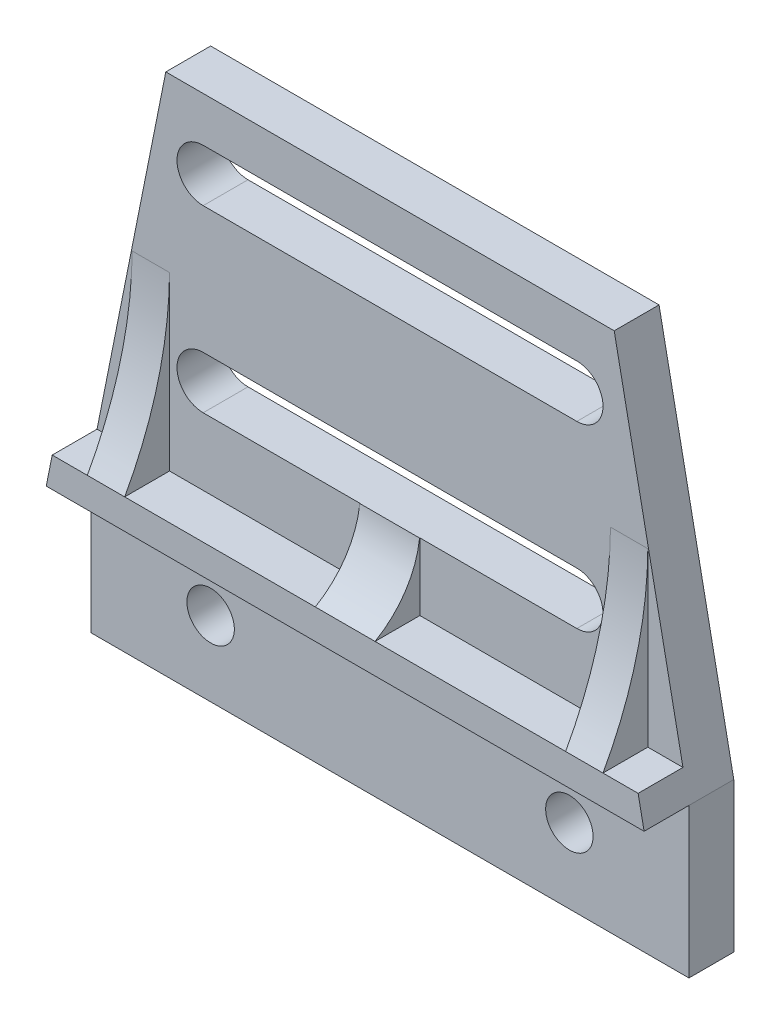
ISO-10303-21;
HEADER;
FILE_DESCRIPTION(('STEP AP214'),'2;1');
FILE_NAME('part.step','',(''),(''),'','','');
FILE_SCHEMA(('AUTOMOTIVE_DESIGN { 1 0 10303 214 1 1 1 1 }'));
ENDSEC;
DATA;
#1=APPLICATION_CONTEXT('core data for automotive mechanical design processes');
#2=APPLICATION_PROTOCOL_DEFINITION('international standard','automotive_design',2000,#1);
#3=PRODUCT_CONTEXT('',#1,'mechanical');
#4=PRODUCT('Part','Part','',(#3));
#5=PRODUCT_RELATED_PRODUCT_CATEGORY('part','',(#4));
#6=PRODUCT_DEFINITION_FORMATION('','',#4);
#7=PRODUCT_DEFINITION_CONTEXT('part definition',#1,'design');
#8=PRODUCT_DEFINITION('design','',#6,#7);
#9=PRODUCT_DEFINITION_SHAPE('','',#8);
#10=(LENGTH_UNIT() NAMED_UNIT(*) SI_UNIT(.MILLI.,.METRE.));
#11=(NAMED_UNIT(*) PLANE_ANGLE_UNIT() SI_UNIT($,.RADIAN.));
#12=(NAMED_UNIT(*) SI_UNIT($,.STERADIAN.) SOLID_ANGLE_UNIT());
#13=UNCERTAINTY_MEASURE_WITH_UNIT(LENGTH_MEASURE(1.E-05),#10,'distance_accuracy_value','');
#14=(GEOMETRIC_REPRESENTATION_CONTEXT(3) GLOBAL_UNCERTAINTY_ASSIGNED_CONTEXT((#13)) GLOBAL_UNIT_ASSIGNED_CONTEXT((#10,
#11,#12)) REPRESENTATION_CONTEXT('',''));
#15=CARTESIAN_POINT('',(0.,0.,0.));
#16=DIRECTION('',(0.,0.,1.));
#17=DIRECTION('',(1.,0.,0.));
#18=AXIS2_PLACEMENT_3D('',#15,#16,#17);
#19=CARTESIAN_POINT('',(0.,0.,3.));
#20=DIRECTION('',(0.,0.,1.));
#21=DIRECTION('',(1.,0.,0.));
#22=AXIS2_PLACEMENT_3D('',#19,#20,#21);
#23=PLANE('',#22);
#24=DIRECTION('',(0.,1.,0.));
#25=VECTOR('',#24,1.);
#26=CARTESIAN_POINT('',(-2.,0.,3.));
#27=LINE('',#26,#25);
#28=CARTESIAN_POINT('',(-2.,7.,3.));
#29=VERTEX_POINT('',#28);
#30=CARTESIAN_POINT('',(-2.,11.5,3.));
#31=VERTEX_POINT('',#30);
#32=EDGE_CURVE('E239',#29,#31,#27,.T.);
#33=ORIENTED_EDGE('',*,*,#32,.T.);
#34=DIRECTION('',(-1.,0.,0.));
#35=VECTOR('',#34,1.);
#36=CARTESIAN_POINT('',(0.,11.5,3.));
#37=LINE('',#36,#35);
#38=CARTESIAN_POINT('',(-12.5,11.5,3.));
#39=VERTEX_POINT('',#38);
#40=EDGE_CURVE('E228',#31,#39,#37,.T.);
#41=ORIENTED_EDGE('',*,*,#40,.T.);
#42=CARTESIAN_POINT('',(-12.5,13.25,3.));
#43=DIRECTION('',(0.,0.,1.));
#44=DIRECTION('',(1.,0.,0.));
#45=AXIS2_PLACEMENT_3D('',#42,#43,#44);
#46=CIRCLE('',#45,1.74999999999999);
#47=CARTESIAN_POINT('',(-12.5,15.,3.));
#48=VERTEX_POINT('',#47);
#49=EDGE_CURVE('E213',#39,#48,#46,.F.);
#50=ORIENTED_EDGE('',*,*,#49,.T.);
#51=DIRECTION('',(1.,0.,0.));
#52=VECTOR('',#51,1.);
#53=CARTESIAN_POINT('',(0.,15.,3.));
#54=LINE('',#53,#52);
#55=CARTESIAN_POINT('',(12.5,15.,3.));
#56=VERTEX_POINT('',#55);
#57=EDGE_CURVE('E250',#48,#56,#54,.T.);
#58=ORIENTED_EDGE('',*,*,#57,.T.);
#59=CARTESIAN_POINT('',(12.5,13.25,3.));
#60=DIRECTION('',(0.,0.,1.));
#61=DIRECTION('',(1.,0.,0.));
#62=AXIS2_PLACEMENT_3D('',#59,#60,#61);
#63=CIRCLE('',#62,1.74999999999999);
#64=CARTESIAN_POINT('',(12.5,11.5,3.));
#65=VERTEX_POINT('',#64);
#66=EDGE_CURVE('E224',#56,#65,#63,.F.);
#67=ORIENTED_EDGE('',*,*,#66,.T.);
#68=CARTESIAN_POINT('',(2.,11.5,3.));
#69=VERTEX_POINT('',#68);
#70=EDGE_CURVE('E240',#65,#69,#37,.T.);
#71=ORIENTED_EDGE('',*,*,#70,.T.);
#72=DIRECTION('',(0.,1.,0.));
#73=VECTOR('',#72,1.);
#74=CARTESIAN_POINT('',(2.,0.,3.));
#75=LINE('',#74,#73);
#76=CARTESIAN_POINT('',(2.,7.,3.));
#77=VERTEX_POINT('',#76);
#78=EDGE_CURVE('E286',#77,#69,#75,.T.);
#79=ORIENTED_EDGE('',*,*,#78,.F.);
#80=DIRECTION('',(1.,0.,0.));
#81=VECTOR('',#80,1.);
#82=CARTESIAN_POINT('',(0.,7.,3.));
#83=LINE('',#82,#81);
#84=CARTESIAN_POINT('',(14.75,7.,3.));
#85=VERTEX_POINT('',#84);
#86=EDGE_CURVE('E352',#77,#85,#83,.T.);
#87=ORIENTED_EDGE('',*,*,#86,.T.);
#88=DIRECTION('',(0.,1.,0.));
#89=VECTOR('',#88,1.);
#90=CARTESIAN_POINT('',(14.75,0.,3.));
#91=LINE('',#90,#89);
#92=CARTESIAN_POINT('',(14.75,18.4999999999995,3.));
#93=VERTEX_POINT('',#92);
#94=EDGE_CURVE('E324',#85,#93,#91,.T.);
#95=ORIENTED_EDGE('',*,*,#94,.T.);
#96=DIRECTION('',(1.,0.,0.));
#97=VECTOR('',#96,1.);
#98=CARTESIAN_POINT('',(16.,18.5,3.));
#99=LINE('',#98,#97);
#100=CARTESIAN_POINT('',(17.25,18.4999999999995,3.));
#101=VERTEX_POINT('',#100);
#102=EDGE_CURVE('E314',#93,#101,#99,.T.);
#103=ORIENTED_EDGE('',*,*,#102,.T.);
#104=DIRECTION('',(0.,1.,0.));
#105=VECTOR('',#104,1.);
#106=CARTESIAN_POINT('',(17.25,0.,3.));
#107=LINE('',#106,#105);
#108=CARTESIAN_POINT('',(17.25,7.,3.));
#109=VERTEX_POINT('',#108);
#110=EDGE_CURVE('E329',#109,#101,#107,.T.);
#111=ORIENTED_EDGE('',*,*,#110,.F.);
#112=CARTESIAN_POINT('',(19.6,7.,3.));
#113=VERTEX_POINT('',#112);
#114=EDGE_CURVE('E332',#109,#113,#83,.T.);
#115=ORIENTED_EDGE('',*,*,#114,.T.);
#116=DIRECTION('',(0.196116135138185,-0.98058067569092,0.));
#117=VECTOR('',#116,1.);
#118=CARTESIAN_POINT('',(20.1923076923077,4.03846153846155,3.));
#119=LINE('',#118,#117);
#120=CARTESIAN_POINT('',(15.,30.,3.));
#121=VERTEX_POINT('',#120);
#122=EDGE_CURVE('E372',#121,#113,#119,.T.);
#123=ORIENTED_EDGE('',*,*,#122,.F.);
#124=DIRECTION('',(-1.,0.,0.));
#125=VECTOR('',#124,1.);
#126=CARTESIAN_POINT('',(0.,30.,3.));
#127=LINE('',#126,#125);
#128=CARTESIAN_POINT('',(-15.,30.,3.));
#129=VERTEX_POINT('',#128);
#130=EDGE_CURVE('E375',#121,#129,#127,.T.);
#131=ORIENTED_EDGE('',*,*,#130,.T.);
#132=DIRECTION('',(-0.196116135138184,-0.98058067569092,0.));
#133=VECTOR('',#132,1.);
#134=CARTESIAN_POINT('',(-20.1923076923077,4.03846153846153,3.));
#135=LINE('',#134,#133);
#136=CARTESIAN_POINT('',(-19.6,7.,3.));
#137=VERTEX_POINT('',#136);
#138=EDGE_CURVE('E377',#129,#137,#135,.T.);
#139=ORIENTED_EDGE('',*,*,#138,.T.);
#140=CARTESIAN_POINT('',(-17.25,7.,3.));
#141=VERTEX_POINT('',#140);
#142=EDGE_CURVE('E347',#137,#141,#83,.T.);
#143=ORIENTED_EDGE('',*,*,#142,.T.);
#144=DIRECTION('',(0.,-1.,0.));
#145=VECTOR('',#144,1.);
#146=CARTESIAN_POINT('',(-17.25,0.,3.));
#147=LINE('',#146,#145);
#148=CARTESIAN_POINT('',(-17.25,18.4999999999991,3.));
#149=VERTEX_POINT('',#148);
#150=EDGE_CURVE('E308',#149,#141,#147,.T.);
#151=ORIENTED_EDGE('',*,*,#150,.F.);
#152=DIRECTION('',(-1.,0.,0.));
#153=VECTOR('',#152,1.);
#154=CARTESIAN_POINT('',(-16.,18.5,3.));
#155=LINE('',#154,#153);
#156=CARTESIAN_POINT('',(-14.75,18.5,3.));
#157=VERTEX_POINT('',#156);
#158=EDGE_CURVE('E293',#157,#149,#155,.T.);
#159=ORIENTED_EDGE('',*,*,#158,.F.);
#160=DIRECTION('',(0.,-1.,0.));
#161=VECTOR('',#160,1.);
#162=CARTESIAN_POINT('',(-14.75,0.,3.));
#163=LINE('',#162,#161);
#164=CARTESIAN_POINT('',(-14.75,7.,3.));
#165=VERTEX_POINT('',#164);
#166=EDGE_CURVE('E303',#157,#165,#163,.T.);
#167=ORIENTED_EDGE('',*,*,#166,.T.);
#168=EDGE_CURVE('E351',#165,#29,#83,.T.);
#169=ORIENTED_EDGE('',*,*,#168,.T.);
#170=EDGE_LOOP('',(#33,#41,#50,#58,#67,#71,#79,#87,#95,#103,#111,#115,#123,#131,#139,#143,#151,
#159,#167,#169));
#171=FACE_BOUND('',#170,.T.);
#172=DIRECTION('',(-1.,0.,0.));
#173=VECTOR('',#172,1.);
#174=CARTESIAN_POINT('',(0.,23.5,3.));
#175=LINE('',#174,#173);
#176=CARTESIAN_POINT('',(12.5,23.5,3.));
#177=VERTEX_POINT('',#176);
#178=CARTESIAN_POINT('',(-12.5,23.5,3.));
#179=VERTEX_POINT('',#178);
#180=EDGE_CURVE('E259',#177,#179,#175,.T.);
#181=ORIENTED_EDGE('',*,*,#180,.T.);
#182=CARTESIAN_POINT('',(-12.5,25.25,3.));
#183=DIRECTION('',(0.,0.,1.));
#184=DIRECTION('',(1.,0.,0.));
#185=AXIS2_PLACEMENT_3D('',#182,#183,#184);
#186=CIRCLE('',#185,1.75);
#187=CARTESIAN_POINT('',(-12.5,27.,3.));
#188=VERTEX_POINT('',#187);
#189=EDGE_CURVE('E262',#179,#188,#186,.F.);
#190=ORIENTED_EDGE('',*,*,#189,.T.);
#191=DIRECTION('',(1.,0.,0.));
#192=VECTOR('',#191,1.);
#193=CARTESIAN_POINT('',(0.,27.,3.));
#194=LINE('',#193,#192);
#195=CARTESIAN_POINT('',(12.5,27.,3.));
#196=VERTEX_POINT('',#195);
#197=EDGE_CURVE('E223',#188,#196,#194,.T.);
#198=ORIENTED_EDGE('',*,*,#197,.T.);
#199=CARTESIAN_POINT('',(12.5,25.25,3.));
#200=DIRECTION('',(0.,0.,1.));
#201=DIRECTION('',(1.,0.,0.));
#202=AXIS2_PLACEMENT_3D('',#199,#200,#201);
#203=CIRCLE('',#202,1.75);
#204=EDGE_CURVE('E256',#196,#177,#203,.F.);
#205=ORIENTED_EDGE('',*,*,#204,.T.);
#206=EDGE_LOOP('',(#181,#190,#198,#205));
#207=FACE_BOUND('',#206,.T.);
#208=ADVANCED_FACE('F35',(#171,#207),#23,.T.);
#209=CARTESIAN_POINT('',(0.,0.,0.));
#210=DIRECTION('',(0.,0.,1.));
#211=DIRECTION('',(1.,0.,0.));
#212=AXIS2_PLACEMENT_3D('',#209,#210,#211);
#213=PLANE('',#212);
#214=CARTESIAN_POINT('',(-12.5,13.25,0.));
#215=DIRECTION('',(0.,0.,1.));
#216=DIRECTION('',(1.,0.,0.));
#217=AXIS2_PLACEMENT_3D('',#214,#215,#216);
#218=CIRCLE('',#217,1.74999999999999);
#219=CARTESIAN_POINT('',(-12.5,11.5,0.));
#220=VERTEX_POINT('',#219);
#221=CARTESIAN_POINT('',(-12.5,15.,0.));
#222=VERTEX_POINT('',#221);
#223=EDGE_CURVE('E421',#220,#222,#218,.F.);
#224=ORIENTED_EDGE('',*,*,#223,.F.);
#225=DIRECTION('',(-1.,0.,0.));
#226=VECTOR('',#225,1.);
#227=CARTESIAN_POINT('',(0.,11.5,0.));
#228=LINE('',#227,#226);
#229=CARTESIAN_POINT('',(12.5,11.5,0.));
#230=VERTEX_POINT('',#229);
#231=EDGE_CURVE('E232',#230,#220,#228,.T.);
#232=ORIENTED_EDGE('',*,*,#231,.F.);
#233=CARTESIAN_POINT('',(12.5,13.25,0.));
#234=DIRECTION('',(0.,0.,1.));
#235=DIRECTION('',(1.,0.,0.));
#236=AXIS2_PLACEMENT_3D('',#233,#234,#235);
#237=CIRCLE('',#236,1.74999999999999);
#238=CARTESIAN_POINT('',(12.5,15.,0.));
#239=VERTEX_POINT('',#238);
#240=EDGE_CURVE('E419',#239,#230,#237,.F.);
#241=ORIENTED_EDGE('',*,*,#240,.F.);
#242=DIRECTION('',(1.,0.,0.));
#243=VECTOR('',#242,1.);
#244=CARTESIAN_POINT('',(0.,15.,0.));
#245=LINE('',#244,#243);
#246=EDGE_CURVE('E417',#222,#239,#245,.T.);
#247=ORIENTED_EDGE('',*,*,#246,.F.);
#248=EDGE_LOOP('',(#224,#232,#241,#247));
#249=FACE_BOUND('',#248,.T.);
#250=CARTESIAN_POINT('',(-12.,0.,0.));
#251=DIRECTION('',(0.,0.,1.));
#252=DIRECTION('',(1.,0.,0.));
#253=AXIS2_PLACEMENT_3D('',#250,#251,#252);
#254=CIRCLE('',#253,1.5875);
#255=CARTESIAN_POINT('',(-10.4125,0.,0.));
#256=VERTEX_POINT('',#255);
#257=EDGE_CURVE('E277',#256,#256,#254,.T.);
#258=ORIENTED_EDGE('',*,*,#257,.T.);
#259=EDGE_LOOP('',(#258));
#260=FACE_BOUND('',#259,.T.);
#261=CARTESIAN_POINT('',(12.,0.,0.));
#262=DIRECTION('',(0.,0.,1.));
#263=DIRECTION('',(1.,0.,0.));
#264=AXIS2_PLACEMENT_3D('',#261,#262,#263);
#265=CIRCLE('',#264,1.5875);
#266=CARTESIAN_POINT('',(13.5875,0.,0.));
#267=VERTEX_POINT('',#266);
#268=EDGE_CURVE('E269',#267,#267,#265,.T.);
#269=ORIENTED_EDGE('',*,*,#268,.T.);
#270=EDGE_LOOP('',(#269));
#271=FACE_BOUND('',#270,.T.);
#272=DIRECTION('',(0.,1.,0.));
#273=VECTOR('',#272,1.);
#274=CARTESIAN_POINT('',(20.,0.,0.));
#275=LINE('',#274,#273);
#276=CARTESIAN_POINT('',(20.,-5.,0.));
#277=VERTEX_POINT('',#276);
#278=CARTESIAN_POINT('',(20.,5.,0.));
#279=VERTEX_POINT('',#278);
#280=EDGE_CURVE('E384',#277,#279,#275,.T.);
#281=ORIENTED_EDGE('',*,*,#280,.F.);
#282=DIRECTION('',(1.,0.,0.));
#283=VECTOR('',#282,1.);
#284=CARTESIAN_POINT('',(0.,-5.,0.));
#285=LINE('',#284,#283);
#286=CARTESIAN_POINT('',(-20.,-5.,0.));
#287=VERTEX_POINT('',#286);
#288=EDGE_CURVE('E365',#287,#277,#285,.T.);
#289=ORIENTED_EDGE('',*,*,#288,.F.);
#290=DIRECTION('',(0.,1.,0.));
#291=VECTOR('',#290,1.);
#292=CARTESIAN_POINT('',(-20.,0.,0.));
#293=LINE('',#292,#291);
#294=CARTESIAN_POINT('',(-20.,5.,0.));
#295=VERTEX_POINT('',#294);
#296=EDGE_CURVE('E369',#287,#295,#293,.T.);
#297=ORIENTED_EDGE('',*,*,#296,.T.);
#298=DIRECTION('',(-0.196116135138184,-0.98058067569092,0.));
#299=VECTOR('',#298,1.);
#300=CARTESIAN_POINT('',(-20.1923076923077,4.03846153846153,0.));
#301=LINE('',#300,#299);
#302=CARTESIAN_POINT('',(-15.,30.,0.));
#303=VERTEX_POINT('',#302);
#304=EDGE_CURVE('E391',#303,#295,#301,.T.);
#305=ORIENTED_EDGE('',*,*,#304,.F.);
#306=DIRECTION('',(-1.,0.,0.));
#307=VECTOR('',#306,1.);
#308=CARTESIAN_POINT('',(0.,30.,0.));
#309=LINE('',#308,#307);
#310=CARTESIAN_POINT('',(15.,30.,0.));
#311=VERTEX_POINT('',#310);
#312=EDGE_CURVE('E389',#311,#303,#309,.T.);
#313=ORIENTED_EDGE('',*,*,#312,.F.);
#314=DIRECTION('',(0.196116135138185,-0.98058067569092,0.));
#315=VECTOR('',#314,1.);
#316=CARTESIAN_POINT('',(20.1923076923077,4.03846153846155,0.));
#317=LINE('',#316,#315);
#318=EDGE_CURVE('E387',#311,#279,#317,.T.);
#319=ORIENTED_EDGE('',*,*,#318,.T.);
#320=EDGE_LOOP('',(#281,#289,#297,#305,#313,#319));
#321=FACE_BOUND('',#320,.T.);
#322=CARTESIAN_POINT('',(-12.5,25.25,0.));
#323=DIRECTION('',(0.,0.,1.));
#324=DIRECTION('',(1.,0.,0.));
#325=AXIS2_PLACEMENT_3D('',#322,#323,#324);
#326=CIRCLE('',#325,1.75);
#327=CARTESIAN_POINT('',(-12.5,23.5,0.));
#328=VERTEX_POINT('',#327);
#329=CARTESIAN_POINT('',(-12.5,27.,0.));
#330=VERTEX_POINT('',#329);
#331=EDGE_CURVE('E11',#328,#330,#326,.F.);
#332=ORIENTED_EDGE('',*,*,#331,.F.);
#333=DIRECTION('',(-1.,0.,0.));
#334=VECTOR('',#333,1.);
#335=CARTESIAN_POINT('',(0.,23.5,0.));
#336=LINE('',#335,#334);
#337=CARTESIAN_POINT('',(12.5,23.5,0.));
#338=VERTEX_POINT('',#337);
#339=EDGE_CURVE('E43',#338,#328,#336,.T.);
#340=ORIENTED_EDGE('',*,*,#339,.F.);
#341=CARTESIAN_POINT('',(12.5,25.25,0.));
#342=DIRECTION('',(0.,0.,1.));
#343=DIRECTION('',(1.,0.,0.));
#344=AXIS2_PLACEMENT_3D('',#341,#342,#343);
#345=CIRCLE('',#344,1.75);
#346=CARTESIAN_POINT('',(12.5,27.,0.));
#347=VERTEX_POINT('',#346);
#348=EDGE_CURVE('E425',#347,#338,#345,.F.);
#349=ORIENTED_EDGE('',*,*,#348,.F.);
#350=DIRECTION('',(1.,0.,0.));
#351=VECTOR('',#350,1.);
#352=CARTESIAN_POINT('',(0.,27.,0.));
#353=LINE('',#352,#351);
#354=EDGE_CURVE('E423',#330,#347,#353,.T.);
#355=ORIENTED_EDGE('',*,*,#354,.F.);
#356=EDGE_LOOP('',(#332,#340,#349,#355));
#357=FACE_BOUND('',#356,.T.);
#358=ADVANCED_FACE('F442',(#249,#260,#271,#321,#357),#213,.F.);
#359=CARTESIAN_POINT('',(2.,12.5,3.));
#360=DIRECTION('',(1.,0.,0.));
#361=DIRECTION('',(0.,0.,-1.));
#362=AXIS2_PLACEMENT_3D('',#359,#360,#361);
#363=PLANE('',#362);
#364=ORIENTED_EDGE('',*,*,#78,.T.);
#365=DIRECTION('',(0.,0.,1.));
#366=VECTOR('',#365,1.);
#367=CARTESIAN_POINT('',(2.,11.5,3.));
#368=LINE('',#367,#366);
#369=CARTESIAN_POINT('',(2.,11.5,3.01783386147471));
#370=VERTEX_POINT('',#369);
#371=EDGE_CURVE('E241',#69,#370,#368,.T.);
#372=ORIENTED_EDGE('',*,*,#371,.T.);
#373=CARTESIAN_POINT('',(2.,12.2101280863781,8.97566216555808));
#374=DIRECTION('',(-1.,0.,0.));
#375=DIRECTION('',(0.,0.,1.));
#376=AXIS2_PLACEMENT_3D('',#373,#374,#375);
#377=CIRCLE('',#376,6.);
#378=CARTESIAN_POINT('',(2.,7.,6.));
#379=VERTEX_POINT('',#378);
#380=EDGE_CURVE('E272',#370,#379,#377,.T.);
#381=ORIENTED_EDGE('',*,*,#380,.T.);
#382=DIRECTION('',(0.,0.,-1.));
#383=VECTOR('',#382,1.);
#384=CARTESIAN_POINT('',(2.,7.,6.));
#385=LINE('',#384,#383);
#386=EDGE_CURVE('E283',#379,#77,#385,.T.);
#387=ORIENTED_EDGE('',*,*,#386,.T.);
#388=EDGE_LOOP('',(#364,#372,#381,#387));
#389=FACE_BOUND('',#388,.T.);
#390=ADVANCED_FACE('F543',(#389),#363,.T.);
#391=CARTESIAN_POINT('',(-2.,12.5,3.));
#392=DIRECTION('',(1.,0.,0.));
#393=DIRECTION('',(0.,0.,-1.));
#394=AXIS2_PLACEMENT_3D('',#391,#392,#393);
#395=PLANE('',#394);
#396=DIRECTION('',(0.,0.,1.));
#397=VECTOR('',#396,1.);
#398=CARTESIAN_POINT('',(-2.,11.5,3.));
#399=LINE('',#398,#397);
#400=CARTESIAN_POINT('',(-2.,11.5,3.01783386147471));
#401=VERTEX_POINT('',#400);
#402=EDGE_CURVE('E245',#31,#401,#399,.T.);
#403=ORIENTED_EDGE('',*,*,#402,.F.);
#404=ORIENTED_EDGE('',*,*,#32,.F.);
#405=DIRECTION('',(0.,0.,-1.));
#406=VECTOR('',#405,1.);
#407=CARTESIAN_POINT('',(-2.,7.,6.));
#408=LINE('',#407,#406);
#409=CARTESIAN_POINT('',(-2.,7.,6.));
#410=VERTEX_POINT('',#409);
#411=EDGE_CURVE('E280',#410,#29,#408,.T.);
#412=ORIENTED_EDGE('',*,*,#411,.F.);
#413=CARTESIAN_POINT('',(-2.,12.2101280863781,8.97566216555808));
#414=DIRECTION('',(-1.,0.,0.));
#415=DIRECTION('',(0.,0.,1.));
#416=AXIS2_PLACEMENT_3D('',#413,#414,#415);
#417=CIRCLE('',#416,6.);
#418=EDGE_CURVE('E275',#401,#410,#417,.T.);
#419=ORIENTED_EDGE('',*,*,#418,.F.);
#420=EDGE_LOOP('',(#403,#404,#412,#419));
#421=FACE_BOUND('',#420,.T.);
#422=ADVANCED_FACE('F461',(#421),#395,.F.);
#423=CARTESIAN_POINT('',(0.,12.2101280863781,8.97566216555808));
#424=DIRECTION('',(-1.,0.,0.));
#425=DIRECTION('',(0.,0.,1.));
#426=AXIS2_PLACEMENT_3D('',#423,#424,#425);
#427=CYLINDRICAL_SURFACE('',#426,6.);
#428=ORIENTED_EDGE('',*,*,#380,.F.);
#429=DIRECTION('',(-1.,0.,0.));
#430=VECTOR('',#429,1.);
#431=CARTESIAN_POINT('',(0.,11.5,3.01783386147471));
#432=LINE('',#431,#430);
#433=EDGE_CURVE('E410',#370,#401,#432,.T.);
#434=ORIENTED_EDGE('',*,*,#433,.T.);
#435=ORIENTED_EDGE('',*,*,#418,.T.);
#436=DIRECTION('',(1.,0.,0.));
#437=VECTOR('',#436,1.);
#438=CARTESIAN_POINT('',(0.,7.,6.));
#439=LINE('',#438,#437);
#440=EDGE_CURVE('E274',#410,#379,#439,.T.);
#441=ORIENTED_EDGE('',*,*,#440,.T.);
#442=EDGE_LOOP('',(#428,#434,#435,#441));
#443=FACE_BOUND('',#442,.T.);
#444=ADVANCED_FACE('F458',(#443),#427,.F.);
#445=CARTESIAN_POINT('',(0.,7.,6.));
#446=DIRECTION('',(0.,1.,0.));
#447=DIRECTION('',(0.,0.,1.));
#448=AXIS2_PLACEMENT_3D('',#445,#446,#447);
#449=PLANE('',#448);
#450=DIRECTION('',(1.,0.,0.));
#451=VECTOR('',#450,1.);
#452=CARTESIAN_POINT('',(0.,7.,6.));
#453=LINE('',#452,#451);
#454=CARTESIAN_POINT('',(-14.75,7.00000000000001,5.99999999999999));
#455=VERTEX_POINT('',#454);
#456=EDGE_CURVE('E337',#455,#410,#453,.T.);
#457=ORIENTED_EDGE('',*,*,#456,.T.);
#458=ORIENTED_EDGE('',*,*,#411,.T.);
#459=ORIENTED_EDGE('',*,*,#168,.F.);
#460=DIRECTION('',(0.,0.,1.));
#461=VECTOR('',#460,1.);
#462=CARTESIAN_POINT('',(-14.75,7.,6.));
#463=LINE('',#462,#461);
#464=EDGE_CURVE('E298',#165,#455,#463,.T.);
#465=ORIENTED_EDGE('',*,*,#464,.T.);
#466=EDGE_LOOP('',(#457,#458,#459,#465));
#467=FACE_BOUND('',#466,.T.);
#468=ADVANCED_FACE('F465',(#467),#449,.T.);
#469=ORIENTED_EDGE('',*,*,#386,.F.);
#470=CARTESIAN_POINT('',(14.75,7.,6.));
#471=VERTEX_POINT('',#470);
#472=EDGE_CURVE('E338',#379,#471,#453,.T.);
#473=ORIENTED_EDGE('',*,*,#472,.T.);
#474=DIRECTION('',(0.,0.,-1.));
#475=VECTOR('',#474,1.);
#476=CARTESIAN_POINT('',(14.75,7.,6.));
#477=LINE('',#476,#475);
#478=EDGE_CURVE('E320',#471,#85,#477,.T.);
#479=ORIENTED_EDGE('',*,*,#478,.T.);
#480=ORIENTED_EDGE('',*,*,#86,.F.);
#481=EDGE_LOOP('',(#469,#473,#479,#480));
#482=FACE_BOUND('',#481,.T.);
#483=ADVANCED_FACE('F584',(#482),#449,.T.);
#484=DIRECTION('',(0.,0.,1.));
#485=VECTOR('',#484,1.);
#486=CARTESIAN_POINT('',(-17.25,7.,6.));
#487=LINE('',#486,#485);
#488=CARTESIAN_POINT('',(-17.25,7.,6.));
#489=VERTEX_POINT('',#488);
#490=EDGE_CURVE('E305',#141,#489,#487,.T.);
#491=ORIENTED_EDGE('',*,*,#490,.F.);
#492=ORIENTED_EDGE('',*,*,#142,.F.);
#493=DIRECTION('',(0.,0.,-1.));
#494=VECTOR('',#493,1.);
#495=CARTESIAN_POINT('',(-19.6,7.,6.));
#496=LINE('',#495,#494);
#497=CARTESIAN_POINT('',(-19.6,7.,6.));
#498=VERTEX_POINT('',#497);
#499=EDGE_CURVE('E362',#498,#137,#496,.T.);
#500=ORIENTED_EDGE('',*,*,#499,.F.);
#501=EDGE_CURVE('E333',#498,#489,#453,.T.);
#502=ORIENTED_EDGE('',*,*,#501,.T.);
#503=EDGE_LOOP('',(#491,#492,#500,#502));
#504=FACE_BOUND('',#503,.T.);
#505=ADVANCED_FACE('F515',(#504),#449,.T.);
#506=CARTESIAN_POINT('',(0.,-5.,3.));
#507=DIRECTION('',(0.,1.,0.));
#508=DIRECTION('',(-1.,0.,0.));
#509=AXIS2_PLACEMENT_3D('',#506,#507,#508);
#510=PLANE('',#509);
#511=DIRECTION('',(0.,0.,-1.));
#512=VECTOR('',#511,1.);
#513=CARTESIAN_POINT('',(20.,-5.,3.));
#514=LINE('',#513,#512);
#515=CARTESIAN_POINT('',(20.,-5.,3.));
#516=VERTEX_POINT('',#515);
#517=EDGE_CURVE('E407',#516,#277,#514,.T.);
#518=ORIENTED_EDGE('',*,*,#517,.F.);
#519=DIRECTION('',(1.,0.,0.));
#520=VECTOR('',#519,1.);
#521=CARTESIAN_POINT('',(0.,-5.,3.));
#522=LINE('',#521,#520);
#523=CARTESIAN_POINT('',(-20.,-5.,3.));
#524=VERTEX_POINT('',#523);
#525=EDGE_CURVE('E366',#524,#516,#522,.T.);
#526=ORIENTED_EDGE('',*,*,#525,.F.);
#527=DIRECTION('',(0.,0.,-1.));
#528=VECTOR('',#527,1.);
#529=CARTESIAN_POINT('',(-20.,-5.,3.));
#530=LINE('',#529,#528);
#531=EDGE_CURVE('E382',#524,#287,#530,.T.);
#532=ORIENTED_EDGE('',*,*,#531,.T.);
#533=ORIENTED_EDGE('',*,*,#288,.T.);
#534=EDGE_LOOP('',(#518,#526,#532,#533));
#535=FACE_BOUND('',#534,.T.);
#536=ADVANCED_FACE('F37',(#535),#510,.F.);
#537=CARTESIAN_POINT('',(20.,0.,3.));
#538=DIRECTION('',(-1.,0.,0.));
#539=DIRECTION('',(0.,-1.,0.));
#540=AXIS2_PLACEMENT_3D('',#537,#538,#539);
#541=PLANE('',#540);
#542=ORIENTED_EDGE('',*,*,#280,.T.);
#543=DIRECTION('',(0.,0.,-1.));
#544=VECTOR('',#543,1.);
#545=CARTESIAN_POINT('',(20.,5.,3.));
#546=LINE('',#545,#544);
#547=CARTESIAN_POINT('',(20.,5.,3.));
#548=VERTEX_POINT('',#547);
#549=EDGE_CURVE('E404',#548,#279,#546,.T.);
#550=ORIENTED_EDGE('',*,*,#549,.F.);
#551=DIRECTION('',(0.,1.,0.));
#552=VECTOR('',#551,1.);
#553=CARTESIAN_POINT('',(20.,0.,3.));
#554=LINE('',#553,#552);
#555=EDGE_CURVE('E368',#516,#548,#554,.T.);
#556=ORIENTED_EDGE('',*,*,#555,.F.);
#557=ORIENTED_EDGE('',*,*,#517,.T.);
#558=EDGE_LOOP('',(#542,#550,#556,#557));
#559=FACE_BOUND('',#558,.T.);
#560=ADVANCED_FACE('F494',(#559),#541,.F.);
#561=CARTESIAN_POINT('',(20.1923076923077,4.03846153846155,3.));
#562=DIRECTION('',(0.98058067569092,0.196116135138184,0.));
#563=DIRECTION('',(-0.196116135138185,0.98058067569092,0.));
#564=AXIS2_PLACEMENT_3D('',#561,#562,#563);
#565=PLANE('',#564);
#566=ORIENTED_EDGE('',*,*,#318,.F.);
#567=DIRECTION('',(0.,0.,-1.));
#568=VECTOR('',#567,1.);
#569=CARTESIAN_POINT('',(15.,30.,3.));
#570=LINE('',#569,#568);
#571=EDGE_CURVE('E402',#121,#311,#570,.T.);
#572=ORIENTED_EDGE('',*,*,#571,.F.);
#573=ORIENTED_EDGE('',*,*,#122,.T.);
#574=DIRECTION('',(0.,0.,-1.));
#575=VECTOR('',#574,1.);
#576=CARTESIAN_POINT('',(19.6,7.,6.));
#577=LINE('',#576,#575);
#578=CARTESIAN_POINT('',(19.6,7.,6.));
#579=VERTEX_POINT('',#578);
#580=EDGE_CURVE('E346',#579,#113,#577,.T.);
#581=ORIENTED_EDGE('',*,*,#580,.F.);
#582=DIRECTION('',(-0.196116135138185,0.98058067569092,0.));
#583=VECTOR('',#582,1.);
#584=CARTESIAN_POINT('',(20.1923076923077,4.03846153846155,6.));
#585=LINE('',#584,#583);
#586=CARTESIAN_POINT('',(20.,5.,6.));
#587=VERTEX_POINT('',#586);
#588=EDGE_CURVE('E343',#587,#579,#585,.T.);
#589=ORIENTED_EDGE('',*,*,#588,.F.);
#590=DIRECTION('',(0.,0.,-1.));
#591=VECTOR('',#590,1.);
#592=CARTESIAN_POINT('',(20.,5.,6.));
#593=LINE('',#592,#591);
#594=EDGE_CURVE('E356',#587,#548,#593,.T.);
#595=ORIENTED_EDGE('',*,*,#594,.T.);
#596=ORIENTED_EDGE('',*,*,#549,.T.);
#597=EDGE_LOOP('',(#566,#572,#573,#581,#589,#595,#596));
#598=FACE_BOUND('',#597,.T.);
#599=ADVANCED_FACE('F475',(#598),#565,.T.);
#600=CARTESIAN_POINT('',(0.,30.,3.));
#601=DIRECTION('',(0.,-1.,0.));
#602=DIRECTION('',(1.,0.,0.));
#603=AXIS2_PLACEMENT_3D('',#600,#601,#602);
#604=PLANE('',#603);
#605=ORIENTED_EDGE('',*,*,#312,.T.);
#606=DIRECTION('',(0.,0.,-1.));
#607=VECTOR('',#606,1.);
#608=CARTESIAN_POINT('',(-15.,30.,3.));
#609=LINE('',#608,#607);
#610=EDGE_CURVE('E399',#129,#303,#609,.T.);
#611=ORIENTED_EDGE('',*,*,#610,.F.);
#612=ORIENTED_EDGE('',*,*,#130,.F.);
#613=ORIENTED_EDGE('',*,*,#571,.T.);
#614=EDGE_LOOP('',(#605,#611,#612,#613));
#615=FACE_BOUND('',#614,.T.);
#616=ADVANCED_FACE('F507',(#615),#604,.F.);
#617=CARTESIAN_POINT('',(-20.1923076923077,4.03846153846153,3.));
#618=DIRECTION('',(0.98058067569092,-0.196116135138184,0.));
#619=DIRECTION('',(0.196116135138184,0.98058067569092,0.));
#620=AXIS2_PLACEMENT_3D('',#617,#618,#619);
#621=PLANE('',#620);
#622=ORIENTED_EDGE('',*,*,#610,.T.);
#623=ORIENTED_EDGE('',*,*,#304,.T.);
#624=DIRECTION('',(0.,0.,-1.));
#625=VECTOR('',#624,1.);
#626=CARTESIAN_POINT('',(-20.,5.,3.));
#627=LINE('',#626,#625);
#628=CARTESIAN_POINT('',(-20.,5.,3.));
#629=VERTEX_POINT('',#628);
#630=EDGE_CURVE('E396',#629,#295,#627,.T.);
#631=ORIENTED_EDGE('',*,*,#630,.F.);
#632=DIRECTION('',(0.,0.,-1.));
#633=VECTOR('',#632,1.);
#634=CARTESIAN_POINT('',(-20.,5.,6.));
#635=LINE('',#634,#633);
#636=CARTESIAN_POINT('',(-20.,5.,6.));
#637=VERTEX_POINT('',#636);
#638=EDGE_CURVE('E359',#637,#629,#635,.T.);
#639=ORIENTED_EDGE('',*,*,#638,.F.);
#640=DIRECTION('',(-0.196116135138184,-0.98058067569092,0.));
#641=VECTOR('',#640,1.);
#642=CARTESIAN_POINT('',(-20.1923076923077,4.03846153846153,6.));
#643=LINE('',#642,#641);
#644=EDGE_CURVE('E336',#498,#637,#643,.T.);
#645=ORIENTED_EDGE('',*,*,#644,.F.);
#646=ORIENTED_EDGE('',*,*,#499,.T.);
#647=ORIENTED_EDGE('',*,*,#138,.F.);
#648=EDGE_LOOP('',(#622,#623,#631,#639,#645,#646,#647));
#649=FACE_BOUND('',#648,.T.);
#650=ADVANCED_FACE('F510',(#649),#621,.F.);
#651=CARTESIAN_POINT('',(-20.,0.,3.));
#652=DIRECTION('',(-1.,0.,0.));
#653=DIRECTION('',(0.,-1.,0.));
#654=AXIS2_PLACEMENT_3D('',#651,#652,#653);
#655=PLANE('',#654);
#656=ORIENTED_EDGE('',*,*,#296,.F.);
#657=ORIENTED_EDGE('',*,*,#531,.F.);
#658=DIRECTION('',(0.,1.,0.));
#659=VECTOR('',#658,1.);
#660=CARTESIAN_POINT('',(-20.,0.,3.));
#661=LINE('',#660,#659);
#662=EDGE_CURVE('E379',#524,#629,#661,.T.);
#663=ORIENTED_EDGE('',*,*,#662,.T.);
#664=ORIENTED_EDGE('',*,*,#630,.T.);
#665=EDGE_LOOP('',(#656,#657,#663,#664));
#666=FACE_BOUND('',#665,.T.);
#667=ADVANCED_FACE('F548',(#666),#655,.T.);
#668=CARTESIAN_POINT('',(-12.,0.,3.));
#669=DIRECTION('',(0.,0.,1.));
#670=DIRECTION('',(1.,0.,0.));
#671=AXIS2_PLACEMENT_3D('',#668,#669,#670);
#672=CIRCLE('',#671,1.5875);
#673=CARTESIAN_POINT('',(-10.4125,0.,3.));
#674=VERTEX_POINT('',#673);
#675=EDGE_CURVE('E266',#674,#674,#672,.T.);
#676=ORIENTED_EDGE('',*,*,#675,.F.);
#677=EDGE_LOOP('',(#676));
#678=FACE_BOUND('',#677,.T.);
#679=CARTESIAN_POINT('',(12.,0.,3.));
#680=DIRECTION('',(0.,0.,1.));
#681=DIRECTION('',(-1.,0.,0.));
#682=AXIS2_PLACEMENT_3D('',#679,#680,#681);
#683=CIRCLE('',#682,1.5875);
#684=CARTESIAN_POINT('',(10.4125,0.,3.));
#685=VERTEX_POINT('',#684);
#686=EDGE_CURVE('E265',#685,#685,#683,.T.);
#687=ORIENTED_EDGE('',*,*,#686,.F.);
#688=EDGE_LOOP('',(#687));
#689=FACE_BOUND('',#688,.T.);
#690=ORIENTED_EDGE('',*,*,#555,.T.);
#691=DIRECTION('',(1.,0.,0.));
#692=VECTOR('',#691,1.);
#693=CARTESIAN_POINT('',(0.,5.,3.));
#694=LINE('',#693,#692);
#695=EDGE_CURVE('E350',#629,#548,#694,.T.);
#696=ORIENTED_EDGE('',*,*,#695,.F.);
#697=ORIENTED_EDGE('',*,*,#662,.F.);
#698=ORIENTED_EDGE('',*,*,#525,.T.);
#699=EDGE_LOOP('',(#690,#696,#697,#698));
#700=FACE_BOUND('',#699,.T.);
#701=ADVANCED_FACE('F497',(#678,#689,#700),#23,.T.);
#702=DIRECTION('',(0.,0.,-1.));
#703=VECTOR('',#702,1.);
#704=CARTESIAN_POINT('',(17.25,7.,6.));
#705=LINE('',#704,#703);
#706=CARTESIAN_POINT('',(17.25,7.00000000000001,5.99999999999999));
#707=VERTEX_POINT('',#706);
#708=EDGE_CURVE('E326',#707,#109,#705,.T.);
#709=ORIENTED_EDGE('',*,*,#708,.F.);
#710=EDGE_CURVE('E339',#707,#579,#453,.T.);
#711=ORIENTED_EDGE('',*,*,#710,.T.);
#712=ORIENTED_EDGE('',*,*,#580,.T.);
#713=ORIENTED_EDGE('',*,*,#114,.F.);
#714=EDGE_LOOP('',(#709,#711,#712,#713));
#715=FACE_BOUND('',#714,.T.);
#716=ADVANCED_FACE('F478',(#715),#449,.T.);
#717=CARTESIAN_POINT('',(0.,5.,6.));
#718=DIRECTION('',(0.,1.,0.));
#719=DIRECTION('',(-1.,0.,0.));
#720=AXIS2_PLACEMENT_3D('',#717,#718,#719);
#721=PLANE('',#720);
#722=ORIENTED_EDGE('',*,*,#594,.F.);
#723=DIRECTION('',(1.,0.,0.));
#724=VECTOR('',#723,1.);
#725=CARTESIAN_POINT('',(0.,5.,6.));
#726=LINE('',#725,#724);
#727=EDGE_CURVE('E341',#637,#587,#726,.T.);
#728=ORIENTED_EDGE('',*,*,#727,.F.);
#729=ORIENTED_EDGE('',*,*,#638,.T.);
#730=ORIENTED_EDGE('',*,*,#695,.T.);
#731=EDGE_LOOP('',(#722,#728,#729,#730));
#732=FACE_BOUND('',#731,.T.);
#733=ADVANCED_FACE('F487',(#732),#721,.F.);
#734=CARTESIAN_POINT('',(0.,0.,6.));
#735=DIRECTION('',(0.,0.,1.));
#736=DIRECTION('',(1.,0.,0.));
#737=AXIS2_PLACEMENT_3D('',#734,#735,#736);
#738=PLANE('',#737);
#739=ORIENTED_EDGE('',*,*,#472,.F.);
#740=ORIENTED_EDGE('',*,*,#440,.F.);
#741=ORIENTED_EDGE('',*,*,#456,.F.);
#742=DIRECTION('',(-1.,0.,0.));
#743=VECTOR('',#742,1.);
#744=CARTESIAN_POINT('',(-16.,7.00000000000001,5.99999999999999));
#745=LINE('',#744,#743);
#746=EDGE_CURVE('E296',#455,#489,#745,.T.);
#747=ORIENTED_EDGE('',*,*,#746,.T.);
#748=ORIENTED_EDGE('',*,*,#501,.F.);
#749=ORIENTED_EDGE('',*,*,#644,.T.);
#750=ORIENTED_EDGE('',*,*,#727,.T.);
#751=ORIENTED_EDGE('',*,*,#588,.T.);
#752=ORIENTED_EDGE('',*,*,#710,.F.);
#753=DIRECTION('',(1.,0.,0.));
#754=VECTOR('',#753,1.);
#755=CARTESIAN_POINT('',(16.,7.00000000000001,5.99999999999999));
#756=LINE('',#755,#754);
#757=EDGE_CURVE('E317',#471,#707,#756,.T.);
#758=ORIENTED_EDGE('',*,*,#757,.F.);
#759=EDGE_LOOP('',(#739,#740,#741,#747,#748,#749,#750,#751,#752,#758));
#760=FACE_BOUND('',#759,.T.);
#761=ADVANCED_FACE('F482',(#760),#738,.T.);
#762=CARTESIAN_POINT('',(17.25,12.5,3.));
#763=DIRECTION('',(1.,0.,0.));
#764=DIRECTION('',(0.,0.,-1.));
#765=AXIS2_PLACEMENT_3D('',#762,#763,#764);
#766=PLANE('',#765);
#767=ORIENTED_EDGE('',*,*,#708,.T.);
#768=ORIENTED_EDGE('',*,*,#110,.T.);
#769=CARTESIAN_POINT('',(17.25,18.619487622932,26.9997025545728));
#770=DIRECTION('',(-1.,0.,0.));
#771=DIRECTION('',(0.,0.,1.));
#772=AXIS2_PLACEMENT_3D('',#769,#770,#771);
#773=CIRCLE('',#772,24.);
#774=EDGE_CURVE('E311',#101,#707,#773,.T.);
#775=ORIENTED_EDGE('',*,*,#774,.T.);
#776=EDGE_LOOP('',(#767,#768,#775));
#777=FACE_BOUND('',#776,.T.);
#778=ADVANCED_FACE('F594',(#777),#766,.T.);
#779=CARTESIAN_POINT('',(16.,18.619487622932,26.9997025545728));
#780=DIRECTION('',(-1.,0.,0.));
#781=DIRECTION('',(0.,0.,1.));
#782=AXIS2_PLACEMENT_3D('',#779,#780,#781);
#783=CYLINDRICAL_SURFACE('',#782,24.);
#784=CARTESIAN_POINT('',(14.75,18.619487622932,26.9997025545728));
#785=DIRECTION('',(-1.,0.,0.));
#786=DIRECTION('',(0.,0.,1.));
#787=AXIS2_PLACEMENT_3D('',#784,#785,#786);
#788=CIRCLE('',#787,24.);
#789=EDGE_CURVE('E310',#93,#471,#788,.T.);
#790=ORIENTED_EDGE('',*,*,#789,.T.);
#791=ORIENTED_EDGE('',*,*,#757,.T.);
#792=ORIENTED_EDGE('',*,*,#774,.F.);
#793=ORIENTED_EDGE('',*,*,#102,.F.);
#794=EDGE_LOOP('',(#790,#791,#792,#793));
#795=FACE_BOUND('',#794,.T.);
#796=ADVANCED_FACE('F595',(#795),#783,.F.);
#797=CARTESIAN_POINT('',(14.75,12.5,3.));
#798=DIRECTION('',(1.,0.,0.));
#799=DIRECTION('',(0.,0.,-1.));
#800=AXIS2_PLACEMENT_3D('',#797,#798,#799);
#801=PLANE('',#800);
#802=ORIENTED_EDGE('',*,*,#94,.F.);
#803=ORIENTED_EDGE('',*,*,#478,.F.);
#804=ORIENTED_EDGE('',*,*,#789,.F.);
#805=EDGE_LOOP('',(#802,#803,#804));
#806=FACE_BOUND('',#805,.T.);
#807=ADVANCED_FACE('F598',(#806),#801,.F.);
#808=CARTESIAN_POINT('',(-16.,18.619487622932,26.9997025545728));
#809=DIRECTION('',(-1.,0.,0.));
#810=DIRECTION('',(0.,0.,1.));
#811=AXIS2_PLACEMENT_3D('',#808,#809,#810);
#812=CYLINDRICAL_SURFACE('',#811,24.);
#813=ORIENTED_EDGE('',*,*,#746,.F.);
#814=CARTESIAN_POINT('',(-14.75,18.619487622932,26.9997025545728));
#815=DIRECTION('',(-1.,0.,0.));
#816=DIRECTION('',(0.,0.,1.));
#817=AXIS2_PLACEMENT_3D('',#814,#815,#816);
#818=CIRCLE('',#817,24.);
#819=EDGE_CURVE('E289',#157,#455,#818,.T.);
#820=ORIENTED_EDGE('',*,*,#819,.F.);
#821=ORIENTED_EDGE('',*,*,#158,.T.);
#822=CARTESIAN_POINT('',(-17.25,18.619487622932,26.9997025545728));
#823=DIRECTION('',(-1.,0.,0.));
#824=DIRECTION('',(0.,0.,1.));
#825=AXIS2_PLACEMENT_3D('',#822,#823,#824);
#826=CIRCLE('',#825,24.);
#827=EDGE_CURVE('E290',#149,#489,#826,.T.);
#828=ORIENTED_EDGE('',*,*,#827,.T.);
#829=EDGE_LOOP('',(#813,#820,#821,#828));
#830=FACE_BOUND('',#829,.T.);
#831=ADVANCED_FACE('F522',(#830),#812,.F.);
#832=CARTESIAN_POINT('',(-17.25,12.5,3.));
#833=DIRECTION('',(-1.,0.,0.));
#834=DIRECTION('',(0.,0.,1.));
#835=AXIS2_PLACEMENT_3D('',#832,#833,#834);
#836=PLANE('',#835);
#837=ORIENTED_EDGE('',*,*,#150,.T.);
#838=ORIENTED_EDGE('',*,*,#490,.T.);
#839=ORIENTED_EDGE('',*,*,#827,.F.);
#840=EDGE_LOOP('',(#837,#838,#839));
#841=FACE_BOUND('',#840,.T.);
#842=ADVANCED_FACE('F519',(#841),#836,.T.);
#843=CARTESIAN_POINT('',(-14.75,12.5,3.));
#844=DIRECTION('',(-1.,0.,0.));
#845=DIRECTION('',(0.,0.,1.));
#846=AXIS2_PLACEMENT_3D('',#843,#844,#845);
#847=PLANE('',#846);
#848=ORIENTED_EDGE('',*,*,#166,.F.);
#849=ORIENTED_EDGE('',*,*,#819,.T.);
#850=ORIENTED_EDGE('',*,*,#464,.F.);
#851=EDGE_LOOP('',(#848,#849,#850));
#852=FACE_BOUND('',#851,.T.);
#853=ADVANCED_FACE('F525',(#852),#847,.F.);
#854=CARTESIAN_POINT('',(12.,0.,-9.));
#855=DIRECTION('',(0.,0.,1.));
#856=DIRECTION('',(1.,0.,0.));
#857=AXIS2_PLACEMENT_3D('',#854,#855,#856);
#858=CYLINDRICAL_SURFACE('',#857,1.5875);
#859=ORIENTED_EDGE('',*,*,#686,.T.);
#860=EDGE_LOOP('',(#859));
#861=FACE_BOUND('',#860,.T.);
#862=ORIENTED_EDGE('',*,*,#268,.F.);
#863=EDGE_LOOP('',(#862));
#864=FACE_BOUND('',#863,.T.);
#865=ADVANCED_FACE('F527',(#861,#864),#858,.F.);
#866=CARTESIAN_POINT('',(-12.,0.,-9.));
#867=DIRECTION('',(0.,0.,1.));
#868=DIRECTION('',(1.,0.,0.));
#869=AXIS2_PLACEMENT_3D('',#866,#867,#868);
#870=CYLINDRICAL_SURFACE('',#869,1.5875);
#871=ORIENTED_EDGE('',*,*,#675,.T.);
#872=EDGE_LOOP('',(#871));
#873=FACE_BOUND('',#872,.T.);
#874=ORIENTED_EDGE('',*,*,#257,.F.);
#875=EDGE_LOOP('',(#874));
#876=FACE_BOUND('',#875,.T.);
#877=ADVANCED_FACE('F533',(#873,#876),#870,.F.);
#878=CARTESIAN_POINT('',(-12.5,13.25,13.));
#879=DIRECTION('',(0.,0.,-1.));
#880=DIRECTION('',(-1.,0.,0.));
#881=AXIS2_PLACEMENT_3D('',#878,#879,#880);
#882=CYLINDRICAL_SURFACE('',#881,1.74999999999999);
#883=DIRECTION('',(0.,0.,-1.));
#884=VECTOR('',#883,1.);
#885=CARTESIAN_POINT('',(-12.5,11.5,13.));
#886=LINE('',#885,#884);
#887=EDGE_CURVE('E217',#39,#220,#886,.T.);
#888=ORIENTED_EDGE('',*,*,#887,.T.);
#889=ORIENTED_EDGE('',*,*,#223,.T.);
#890=DIRECTION('',(0.,0.,-1.));
#891=VECTOR('',#890,1.);
#892=CARTESIAN_POINT('',(-12.5,15.,13.));
#893=LINE('',#892,#891);
#894=EDGE_CURVE('E219',#48,#222,#893,.T.);
#895=ORIENTED_EDGE('',*,*,#894,.F.);
#896=ORIENTED_EDGE('',*,*,#49,.F.);
#897=EDGE_LOOP('',(#888,#889,#895,#896));
#898=FACE_BOUND('',#897,.T.);
#899=ADVANCED_FACE('F215',(#898),#882,.F.);
#900=CARTESIAN_POINT('',(12.5,13.25,13.));
#901=DIRECTION('',(0.,0.,-1.));
#902=DIRECTION('',(-1.,0.,0.));
#903=AXIS2_PLACEMENT_3D('',#900,#901,#902);
#904=CYLINDRICAL_SURFACE('',#903,1.74999999999999);
#905=DIRECTION('',(0.,0.,-1.));
#906=VECTOR('',#905,1.);
#907=CARTESIAN_POINT('',(12.5,15.,13.));
#908=LINE('',#907,#906);
#909=EDGE_CURVE('E451',#56,#239,#908,.T.);
#910=ORIENTED_EDGE('',*,*,#909,.T.);
#911=ORIENTED_EDGE('',*,*,#240,.T.);
#912=DIRECTION('',(0.,0.,-1.));
#913=VECTOR('',#912,1.);
#914=CARTESIAN_POINT('',(12.5,11.5,13.));
#915=LINE('',#914,#913);
#916=EDGE_CURVE('E233',#65,#230,#915,.T.);
#917=ORIENTED_EDGE('',*,*,#916,.F.);
#918=ORIENTED_EDGE('',*,*,#66,.F.);
#919=EDGE_LOOP('',(#910,#911,#917,#918));
#920=FACE_BOUND('',#919,.T.);
#921=ADVANCED_FACE('F571',(#920),#904,.F.);
#922=CARTESIAN_POINT('',(-12.5,15.,13.));
#923=DIRECTION('',(0.,-1.,0.));
#924=DIRECTION('',(0.,0.,-1.));
#925=AXIS2_PLACEMENT_3D('',#922,#923,#924);
#926=PLANE('',#925);
#927=ORIENTED_EDGE('',*,*,#894,.T.);
#928=ORIENTED_EDGE('',*,*,#246,.T.);
#929=ORIENTED_EDGE('',*,*,#909,.F.);
#930=ORIENTED_EDGE('',*,*,#57,.F.);
#931=EDGE_LOOP('',(#927,#928,#929,#930));
#932=FACE_BOUND('',#931,.T.);
#933=ADVANCED_FACE('F727',(#932),#926,.T.);
#934=CARTESIAN_POINT('',(-12.5,11.5,13.));
#935=DIRECTION('',(0.,1.,0.));
#936=DIRECTION('',(0.,0.,1.));
#937=AXIS2_PLACEMENT_3D('',#934,#935,#936);
#938=PLANE('',#937);
#939=ORIENTED_EDGE('',*,*,#231,.T.);
#940=ORIENTED_EDGE('',*,*,#887,.F.);
#941=ORIENTED_EDGE('',*,*,#40,.F.);
#942=ORIENTED_EDGE('',*,*,#402,.T.);
#943=ORIENTED_EDGE('',*,*,#433,.F.);
#944=ORIENTED_EDGE('',*,*,#371,.F.);
#945=ORIENTED_EDGE('',*,*,#70,.F.);
#946=ORIENTED_EDGE('',*,*,#916,.T.);
#947=EDGE_LOOP('',(#939,#940,#941,#942,#943,#944,#945,#946));
#948=FACE_BOUND('',#947,.T.);
#949=ADVANCED_FACE('F227',(#948),#938,.T.);
#950=CARTESIAN_POINT('',(-12.5,25.25,13.));
#951=DIRECTION('',(0.,0.,-1.));
#952=DIRECTION('',(-1.,0.,0.));
#953=AXIS2_PLACEMENT_3D('',#950,#951,#952);
#954=CYLINDRICAL_SURFACE('',#953,1.75);
#955=DIRECTION('',(0.,0.,-1.));
#956=VECTOR('',#955,1.);
#957=CARTESIAN_POINT('',(-12.5,23.5,13.));
#958=LINE('',#957,#956);
#959=EDGE_CURVE('E432',#179,#328,#958,.T.);
#960=ORIENTED_EDGE('',*,*,#959,.T.);
#961=ORIENTED_EDGE('',*,*,#331,.T.);
#962=DIRECTION('',(0.,0.,-1.));
#963=VECTOR('',#962,1.);
#964=CARTESIAN_POINT('',(-12.5,27.,13.));
#965=LINE('',#964,#963);
#966=EDGE_CURVE('E55',#188,#330,#965,.T.);
#967=ORIENTED_EDGE('',*,*,#966,.F.);
#968=ORIENTED_EDGE('',*,*,#189,.F.);
#969=EDGE_LOOP('',(#960,#961,#967,#968));
#970=FACE_BOUND('',#969,.T.);
#971=ADVANCED_FACE('F439',(#970),#954,.F.);
#972=CARTESIAN_POINT('',(-12.5,23.5,13.));
#973=DIRECTION('',(0.,1.,0.));
#974=DIRECTION('',(0.,0.,1.));
#975=AXIS2_PLACEMENT_3D('',#972,#973,#974);
#976=PLANE('',#975);
#977=DIRECTION('',(0.,0.,-1.));
#978=VECTOR('',#977,1.);
#979=CARTESIAN_POINT('',(12.5,23.5,13.));
#980=LINE('',#979,#978);
#981=EDGE_CURVE('E434',#177,#338,#980,.T.);
#982=ORIENTED_EDGE('',*,*,#981,.T.);
#983=ORIENTED_EDGE('',*,*,#339,.T.);
#984=ORIENTED_EDGE('',*,*,#959,.F.);
#985=ORIENTED_EDGE('',*,*,#180,.F.);
#986=EDGE_LOOP('',(#982,#983,#984,#985));
#987=FACE_BOUND('',#986,.T.);
#988=ADVANCED_FACE('F431',(#987),#976,.T.);
#989=CARTESIAN_POINT('',(12.5,25.25,13.));
#990=DIRECTION('',(0.,0.,-1.));
#991=DIRECTION('',(-1.,0.,0.));
#992=AXIS2_PLACEMENT_3D('',#989,#990,#991);
#993=CYLINDRICAL_SURFACE('',#992,1.75);
#994=DIRECTION('',(0.,0.,-1.));
#995=VECTOR('',#994,1.);
#996=CARTESIAN_POINT('',(12.5,27.,13.));
#997=LINE('',#996,#995);
#998=EDGE_CURVE('E50',#196,#347,#997,.T.);
#999=ORIENTED_EDGE('',*,*,#998,.T.);
#1000=ORIENTED_EDGE('',*,*,#348,.T.);
#1001=ORIENTED_EDGE('',*,*,#981,.F.);
#1002=ORIENTED_EDGE('',*,*,#204,.F.);
#1003=EDGE_LOOP('',(#999,#1000,#1001,#1002));
#1004=FACE_BOUND('',#1003,.T.);
#1005=ADVANCED_FACE('F445',(#1004),#993,.F.);
#1006=CARTESIAN_POINT('',(-12.5,27.,13.));
#1007=DIRECTION('',(0.,-1.,0.));
#1008=DIRECTION('',(0.,0.,-1.));
#1009=AXIS2_PLACEMENT_3D('',#1006,#1007,#1008);
#1010=PLANE('',#1009);
#1011=ORIENTED_EDGE('',*,*,#966,.T.);
#1012=ORIENTED_EDGE('',*,*,#354,.T.);
#1013=ORIENTED_EDGE('',*,*,#998,.F.);
#1014=ORIENTED_EDGE('',*,*,#197,.F.);
#1015=EDGE_LOOP('',(#1011,#1012,#1013,#1014));
#1016=FACE_BOUND('',#1015,.T.);
#1017=ADVANCED_FACE('F443',(#1016),#1010,.T.);
#1018=CLOSED_SHELL('',(#208,#358,#390,#422,#444,#468,#483,#505,#536,#560,#599,#616,#650,#667,
#701,#716,#733,#761,#778,#796,#807,#831,#842,#853,#865,#877,#899,#921,#933,#949,#971,#988,#1005,#1017));
#1019=MANIFOLD_SOLID_BREP('B2',#1018);
#1020=ADVANCED_BREP_SHAPE_REPRESENTATION('',(#18,#1019),#14);
#1021=SHAPE_DEFINITION_REPRESENTATION(#9,#1020);
ENDSEC;
END-ISO-10303-21;
